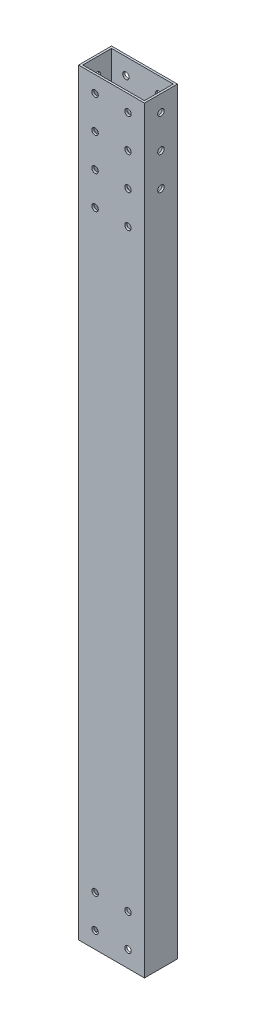
ISO-10303-21;
HEADER;
FILE_DESCRIPTION(('STEP AP214'),'2;1');
FILE_NAME('part.step','',(''),(''),'','','');
FILE_SCHEMA(('AUTOMOTIVE_DESIGN { 1 0 10303 214 1 1 1 1 }'));
ENDSEC;
DATA;
#1=APPLICATION_CONTEXT('core data for automotive mechanical design processes');
#2=APPLICATION_PROTOCOL_DEFINITION('international standard','automotive_design',2000,#1);
#3=PRODUCT_CONTEXT('',#1,'mechanical');
#4=PRODUCT('Part','Part','',(#3));
#5=PRODUCT_RELATED_PRODUCT_CATEGORY('part','',(#4));
#6=PRODUCT_DEFINITION_FORMATION('','',#4);
#7=PRODUCT_DEFINITION_CONTEXT('part definition',#1,'design');
#8=PRODUCT_DEFINITION('design','',#6,#7);
#9=PRODUCT_DEFINITION_SHAPE('','',#8);
#10=(LENGTH_UNIT() NAMED_UNIT(*) SI_UNIT(.MILLI.,.METRE.));
#11=(NAMED_UNIT(*) PLANE_ANGLE_UNIT() SI_UNIT($,.RADIAN.));
#12=(NAMED_UNIT(*) SI_UNIT($,.STERADIAN.) SOLID_ANGLE_UNIT());
#13=UNCERTAINTY_MEASURE_WITH_UNIT(LENGTH_MEASURE(1.E-05),#10,'distance_accuracy_value','');
#14=(GEOMETRIC_REPRESENTATION_CONTEXT(3) GLOBAL_UNCERTAINTY_ASSIGNED_CONTEXT((#13)) GLOBAL_UNIT_ASSIGNED_CONTEXT((#10,
#11,#12)) REPRESENTATION_CONTEXT('',''));
#15=CARTESIAN_POINT('',(0.,0.,0.));
#16=DIRECTION('',(0.,0.,1.));
#17=DIRECTION('',(1.,0.,0.));
#18=AXIS2_PLACEMENT_3D('',#15,#16,#17);
#19=CARTESIAN_POINT('',(533.4,627.126,12.7));
#20=DIRECTION('',(0.,-1.,0.));
#21=DIRECTION('',(0.,0.,-1.));
#22=AXIS2_PLACEMENT_3D('',#19,#20,#21);
#23=PLANE('',#22);
#24=DIRECTION('',(-1.,0.,0.));
#25=VECTOR('',#24,1.);
#26=CARTESIAN_POINT('',(533.4,627.126,-12.7));
#27=LINE('',#26,#25);
#28=CARTESIAN_POINT('',(533.4,627.126,-12.7));
#29=VERTEX_POINT('',#28);
#30=CARTESIAN_POINT('',(482.6,627.126,-12.7));
#31=VERTEX_POINT('',#30);
#32=EDGE_CURVE('E134',#29,#31,#27,.T.);
#33=ORIENTED_EDGE('',*,*,#32,.T.);
#34=DIRECTION('',(0.,0.,-1.));
#35=VECTOR('',#34,1.);
#36=CARTESIAN_POINT('',(482.6,627.126,12.7));
#37=LINE('',#36,#35);
#38=CARTESIAN_POINT('',(482.6,627.126,12.7));
#39=VERTEX_POINT('',#38);
#40=EDGE_CURVE('E11',#39,#31,#37,.T.);
#41=ORIENTED_EDGE('',*,*,#40,.F.);
#42=DIRECTION('',(-1.,0.,0.));
#43=VECTOR('',#42,1.);
#44=CARTESIAN_POINT('',(533.4,627.126,12.7));
#45=LINE('',#44,#43);
#46=CARTESIAN_POINT('',(533.4,627.126,12.7));
#47=VERTEX_POINT('',#46);
#48=EDGE_CURVE('E140',#47,#39,#45,.T.);
#49=ORIENTED_EDGE('',*,*,#48,.F.);
#50=DIRECTION('',(0.,0.,-1.));
#51=VECTOR('',#50,1.);
#52=CARTESIAN_POINT('',(533.4,627.126,12.7));
#53=LINE('',#52,#51);
#54=EDGE_CURVE('E152',#47,#29,#53,.T.);
#55=ORIENTED_EDGE('',*,*,#54,.T.);
#56=EDGE_LOOP('',(#33,#41,#49,#55));
#57=FACE_BOUND('',#56,.T.);
#58=DIRECTION('',(-1.,0.,0.));
#59=VECTOR('',#58,1.);
#60=CARTESIAN_POINT('',(533.4,627.126,-11.1125));
#61=LINE('',#60,#59);
#62=CARTESIAN_POINT('',(531.8125,627.126,-11.1125));
#63=VERTEX_POINT('',#62);
#64=CARTESIAN_POINT('',(484.1875,627.126,-11.1125));
#65=VERTEX_POINT('',#64);
#66=EDGE_CURVE('E120',#63,#65,#61,.T.);
#67=ORIENTED_EDGE('',*,*,#66,.F.);
#68=DIRECTION('',(0.,0.,-1.));
#69=VECTOR('',#68,1.);
#70=CARTESIAN_POINT('',(531.8125,627.126,12.7));
#71=LINE('',#70,#69);
#72=CARTESIAN_POINT('',(531.8125,627.126,11.1125));
#73=VERTEX_POINT('',#72);
#74=EDGE_CURVE('E131',#73,#63,#71,.T.);
#75=ORIENTED_EDGE('',*,*,#74,.F.);
#76=DIRECTION('',(-1.,0.,0.));
#77=VECTOR('',#76,1.);
#78=CARTESIAN_POINT('',(533.4,627.126,11.1125));
#79=LINE('',#78,#77);
#80=CARTESIAN_POINT('',(484.1875,627.126,11.1125));
#81=VERTEX_POINT('',#80);
#82=EDGE_CURVE('E127',#73,#81,#79,.T.);
#83=ORIENTED_EDGE('',*,*,#82,.T.);
#84=DIRECTION('',(0.,0.,-1.));
#85=VECTOR('',#84,1.);
#86=CARTESIAN_POINT('',(484.1875,627.126,12.7));
#87=LINE('',#86,#85);
#88=EDGE_CURVE('E111',#81,#65,#87,.T.);
#89=ORIENTED_EDGE('',*,*,#88,.T.);
#90=EDGE_LOOP('',(#67,#75,#83,#89));
#91=FACE_BOUND('',#90,.T.);
#92=ADVANCED_FACE('F37',(#57,#91),#23,.F.);
#93=CARTESIAN_POINT('',(533.4,42.926,12.7));
#94=DIRECTION('',(0.,-1.,0.));
#95=DIRECTION('',(1.,0.,0.));
#96=AXIS2_PLACEMENT_3D('',#93,#94,#95);
#97=PLANE('',#96);
#98=DIRECTION('',(-1.,0.,0.));
#99=VECTOR('',#98,1.);
#100=CARTESIAN_POINT('',(533.4,42.926,-12.7));
#101=LINE('',#100,#99);
#102=CARTESIAN_POINT('',(533.4,42.926,-12.7));
#103=VERTEX_POINT('',#102);
#104=CARTESIAN_POINT('',(482.6,42.926,-12.7));
#105=VERTEX_POINT('',#104);
#106=EDGE_CURVE('E158',#103,#105,#101,.T.);
#107=ORIENTED_EDGE('',*,*,#106,.F.);
#108=DIRECTION('',(0.,0.,-1.));
#109=VECTOR('',#108,1.);
#110=CARTESIAN_POINT('',(533.4,42.926,12.7));
#111=LINE('',#110,#109);
#112=CARTESIAN_POINT('',(533.4,42.926,12.7));
#113=VERTEX_POINT('',#112);
#114=EDGE_CURVE('E164',#113,#103,#111,.T.);
#115=ORIENTED_EDGE('',*,*,#114,.F.);
#116=DIRECTION('',(-1.,0.,0.));
#117=VECTOR('',#116,1.);
#118=CARTESIAN_POINT('',(533.4,42.926,12.7));
#119=LINE('',#118,#117);
#120=CARTESIAN_POINT('',(482.6,42.926,12.7));
#121=VERTEX_POINT('',#120);
#122=EDGE_CURVE('E146',#113,#121,#119,.T.);
#123=ORIENTED_EDGE('',*,*,#122,.T.);
#124=DIRECTION('',(0.,0.,-1.));
#125=VECTOR('',#124,1.);
#126=CARTESIAN_POINT('',(482.6,42.926,12.7));
#127=LINE('',#126,#125);
#128=EDGE_CURVE('E45',#121,#105,#127,.T.);
#129=ORIENTED_EDGE('',*,*,#128,.T.);
#130=EDGE_LOOP('',(#107,#115,#123,#129));
#131=FACE_BOUND('',#130,.T.);
#132=DIRECTION('',(0.,0.,-1.));
#133=VECTOR('',#132,1.);
#134=CARTESIAN_POINT('',(531.8125,42.926,12.7));
#135=LINE('',#134,#133);
#136=CARTESIAN_POINT('',(531.8125,42.926,11.1125));
#137=VERTEX_POINT('',#136);
#138=CARTESIAN_POINT('',(531.8125,42.926,-11.1125));
#139=VERTEX_POINT('',#138);
#140=EDGE_CURVE('E112',#137,#139,#135,.T.);
#141=ORIENTED_EDGE('',*,*,#140,.T.);
#142=DIRECTION('',(-1.,0.,0.));
#143=VECTOR('',#142,1.);
#144=CARTESIAN_POINT('',(533.4,42.926,-11.1125));
#145=LINE('',#144,#143);
#146=CARTESIAN_POINT('',(484.1875,42.926,-11.1125));
#147=VERTEX_POINT('',#146);
#148=EDGE_CURVE('E117',#139,#147,#145,.T.);
#149=ORIENTED_EDGE('',*,*,#148,.T.);
#150=DIRECTION('',(0.,0.,-1.));
#151=VECTOR('',#150,1.);
#152=CARTESIAN_POINT('',(484.1875,42.926,12.7));
#153=LINE('',#152,#151);
#154=CARTESIAN_POINT('',(484.1875,42.926,11.1125));
#155=VERTEX_POINT('',#154);
#156=EDGE_CURVE('E102',#155,#147,#153,.T.);
#157=ORIENTED_EDGE('',*,*,#156,.F.);
#158=DIRECTION('',(-1.,0.,0.));
#159=VECTOR('',#158,1.);
#160=CARTESIAN_POINT('',(533.4,42.926,11.1125));
#161=LINE('',#160,#159);
#162=EDGE_CURVE('E60',#137,#155,#161,.T.);
#163=ORIENTED_EDGE('',*,*,#162,.F.);
#164=EDGE_LOOP('',(#141,#149,#157,#163));
#165=FACE_BOUND('',#164,.T.);
#166=ADVANCED_FACE('F124',(#131,#165),#97,.T.);
#167=CARTESIAN_POINT('',(482.6,627.126,12.7));
#168=DIRECTION('',(1.,0.,0.));
#169=DIRECTION('',(0.,0.,-1.));
#170=AXIS2_PLACEMENT_3D('',#167,#168,#169);
#171=PLANE('',#170);
#172=CARTESIAN_POINT('',(482.6,614.426,0.));
#173=DIRECTION('',(-1.,0.,0.));
#174=DIRECTION('',(0.,0.,1.));
#175=AXIS2_PLACEMENT_3D('',#172,#173,#174);
#176=CIRCLE('',#175,2.48919999999994);
#177=CARTESIAN_POINT('',(482.6,614.426,2.48919999999994));
#178=VERTEX_POINT('',#177);
#179=EDGE_CURVE('E366',#178,#178,#176,.T.);
#180=ORIENTED_EDGE('',*,*,#179,.F.);
#181=EDGE_LOOP('',(#180));
#182=FACE_BOUND('',#181,.T.);
#183=CARTESIAN_POINT('',(482.6,589.026,0.));
#184=DIRECTION('',(-1.,0.,0.));
#185=DIRECTION('',(0.,0.,1.));
#186=AXIS2_PLACEMENT_3D('',#183,#184,#185);
#187=CIRCLE('',#186,2.48919999999997);
#188=CARTESIAN_POINT('',(482.6,589.026,2.48919999999997));
#189=VERTEX_POINT('',#188);
#190=EDGE_CURVE('E370',#189,#189,#187,.T.);
#191=ORIENTED_EDGE('',*,*,#190,.F.);
#192=EDGE_LOOP('',(#191));
#193=FACE_BOUND('',#192,.T.);
#194=CARTESIAN_POINT('',(482.6,563.626,0.));
#195=DIRECTION('',(-1.,0.,0.));
#196=DIRECTION('',(0.,0.,1.));
#197=AXIS2_PLACEMENT_3D('',#194,#195,#196);
#198=CIRCLE('',#197,2.48919999999998);
#199=CARTESIAN_POINT('',(482.6,563.626,2.48919999999998));
#200=VERTEX_POINT('',#199);
#201=EDGE_CURVE('E227',#200,#200,#198,.T.);
#202=ORIENTED_EDGE('',*,*,#201,.F.);
#203=EDGE_LOOP('',(#202));
#204=FACE_BOUND('',#203,.T.);
#205=DIRECTION('',(0.,-1.,0.));
#206=VECTOR('',#205,1.);
#207=CARTESIAN_POINT('',(482.6,627.126,-12.7));
#208=LINE('',#207,#206);
#209=EDGE_CURVE('E155',#31,#105,#208,.T.);
#210=ORIENTED_EDGE('',*,*,#209,.T.);
#211=ORIENTED_EDGE('',*,*,#128,.F.);
#212=DIRECTION('',(0.,-1.,0.));
#213=VECTOR('',#212,1.);
#214=CARTESIAN_POINT('',(482.6,627.126,12.7));
#215=LINE('',#214,#213);
#216=EDGE_CURVE('E143',#39,#121,#215,.T.);
#217=ORIENTED_EDGE('',*,*,#216,.F.);
#218=ORIENTED_EDGE('',*,*,#40,.T.);
#219=EDGE_LOOP('',(#210,#211,#217,#218));
#220=FACE_BOUND('',#219,.T.);
#221=ADVANCED_FACE('F328',(#182,#193,#204,#220),#171,.F.);
#222=CARTESIAN_POINT('',(533.4,627.126,12.7));
#223=DIRECTION('',(1.,0.,0.));
#224=DIRECTION('',(0.,0.,-1.));
#225=AXIS2_PLACEMENT_3D('',#222,#223,#224);
#226=PLANE('',#225);
#227=CARTESIAN_POINT('',(533.4,614.426,0.));
#228=DIRECTION('',(-1.,0.,0.));
#229=DIRECTION('',(0.,0.,1.));
#230=AXIS2_PLACEMENT_3D('',#227,#228,#229);
#231=CIRCLE('',#230,2.48919999999994);
#232=CARTESIAN_POINT('',(533.4,614.426,2.48919999999994));
#233=VERTEX_POINT('',#232);
#234=EDGE_CURVE('E203',#233,#233,#231,.T.);
#235=ORIENTED_EDGE('',*,*,#234,.T.);
#236=EDGE_LOOP('',(#235));
#237=FACE_BOUND('',#236,.T.);
#238=CARTESIAN_POINT('',(533.4,589.026,0.));
#239=DIRECTION('',(-1.,0.,0.));
#240=DIRECTION('',(0.,0.,1.));
#241=AXIS2_PLACEMENT_3D('',#238,#239,#240);
#242=CIRCLE('',#241,2.48919999999997);
#243=CARTESIAN_POINT('',(533.4,589.026,2.48919999999997));
#244=VERTEX_POINT('',#243);
#245=EDGE_CURVE('E232',#244,#244,#242,.T.);
#246=ORIENTED_EDGE('',*,*,#245,.T.);
#247=EDGE_LOOP('',(#246));
#248=FACE_BOUND('',#247,.T.);
#249=CARTESIAN_POINT('',(533.4,563.626,0.));
#250=DIRECTION('',(-1.,0.,0.));
#251=DIRECTION('',(0.,0.,1.));
#252=AXIS2_PLACEMENT_3D('',#249,#250,#251);
#253=CIRCLE('',#252,2.48919999999998);
#254=CARTESIAN_POINT('',(533.4,563.626,2.48919999999998));
#255=VERTEX_POINT('',#254);
#256=EDGE_CURVE('E223',#255,#255,#253,.T.);
#257=ORIENTED_EDGE('',*,*,#256,.T.);
#258=EDGE_LOOP('',(#257));
#259=FACE_BOUND('',#258,.T.);
#260=DIRECTION('',(0.,-1.,0.));
#261=VECTOR('',#260,1.);
#262=CARTESIAN_POINT('',(533.4,627.126,-12.7));
#263=LINE('',#262,#261);
#264=EDGE_CURVE('E144',#29,#103,#263,.T.);
#265=ORIENTED_EDGE('',*,*,#264,.F.);
#266=ORIENTED_EDGE('',*,*,#54,.F.);
#267=DIRECTION('',(0.,-1.,0.));
#268=VECTOR('',#267,1.);
#269=CARTESIAN_POINT('',(533.4,627.126,12.7));
#270=LINE('',#269,#268);
#271=EDGE_CURVE('E149',#47,#113,#270,.T.);
#272=ORIENTED_EDGE('',*,*,#271,.T.);
#273=ORIENTED_EDGE('',*,*,#114,.T.);
#274=EDGE_LOOP('',(#265,#266,#272,#273));
#275=FACE_BOUND('',#274,.T.);
#276=ADVANCED_FACE('F337',(#237,#248,#259,#275),#226,.T.);
#277=CARTESIAN_POINT('',(0.,0.,12.7));
#278=DIRECTION('',(0.,0.,1.));
#279=DIRECTION('',(1.,0.,0.));
#280=AXIS2_PLACEMENT_3D('',#277,#278,#279);
#281=PLANE('',#280);
#282=CARTESIAN_POINT('',(495.300000000002,55.626,12.7));
#283=DIRECTION('',(0.,0.,1.));
#284=DIRECTION('',(1.,0.,0.));
#285=AXIS2_PLACEMENT_3D('',#282,#283,#284);
#286=CIRCLE('',#285,2.48920000000001);
#287=CARTESIAN_POINT('',(497.789200000002,55.626,12.7));
#288=VERTEX_POINT('',#287);
#289=EDGE_CURVE('E794',#288,#288,#286,.T.);
#290=ORIENTED_EDGE('',*,*,#289,.F.);
#291=EDGE_LOOP('',(#290));
#292=FACE_BOUND('',#291,.T.);
#293=CARTESIAN_POINT('',(520.700000000002,55.6260000000004,12.7));
#294=DIRECTION('',(0.,0.,1.));
#295=DIRECTION('',(1.,0.,0.));
#296=AXIS2_PLACEMENT_3D('',#293,#294,#295);
#297=CIRCLE('',#296,2.48920000000006);
#298=CARTESIAN_POINT('',(523.189200000002,55.6260000000004,12.7));
#299=VERTEX_POINT('',#298);
#300=EDGE_CURVE('E795',#299,#299,#297,.T.);
#301=ORIENTED_EDGE('',*,*,#300,.F.);
#302=EDGE_LOOP('',(#301));
#303=FACE_BOUND('',#302,.T.);
#304=CARTESIAN_POINT('',(520.700000000002,81.0260000000004,12.7));
#305=DIRECTION('',(0.,0.,1.));
#306=DIRECTION('',(1.,0.,0.));
#307=AXIS2_PLACEMENT_3D('',#304,#305,#306);
#308=CIRCLE('',#307,2.48919999999995);
#309=CARTESIAN_POINT('',(523.189200000002,81.0260000000004,12.7));
#310=VERTEX_POINT('',#309);
#311=EDGE_CURVE('E798',#310,#310,#308,.T.);
#312=ORIENTED_EDGE('',*,*,#311,.F.);
#313=EDGE_LOOP('',(#312));
#314=FACE_BOUND('',#313,.T.);
#315=CARTESIAN_POINT('',(495.300000000002,81.026,12.7));
#316=DIRECTION('',(0.,0.,1.));
#317=DIRECTION('',(1.,0.,0.));
#318=AXIS2_PLACEMENT_3D('',#315,#316,#317);
#319=CIRCLE('',#318,2.48920000000001);
#320=CARTESIAN_POINT('',(497.789200000002,81.026,12.7));
#321=VERTEX_POINT('',#320);
#322=EDGE_CURVE('E216',#321,#321,#319,.T.);
#323=ORIENTED_EDGE('',*,*,#322,.F.);
#324=EDGE_LOOP('',(#323));
#325=FACE_BOUND('',#324,.T.);
#326=CARTESIAN_POINT('',(520.700000000001,563.626,12.7));
#327=DIRECTION('',(0.,0.,1.));
#328=DIRECTION('',(1.,0.,0.));
#329=AXIS2_PLACEMENT_3D('',#326,#327,#328);
#330=CIRCLE('',#329,2.48919999999994);
#331=CARTESIAN_POINT('',(523.189200000001,563.626,12.7));
#332=VERTEX_POINT('',#331);
#333=EDGE_CURVE('E265',#332,#332,#330,.T.);
#334=ORIENTED_EDGE('',*,*,#333,.F.);
#335=EDGE_LOOP('',(#334));
#336=FACE_BOUND('',#335,.T.);
#337=CARTESIAN_POINT('',(495.3,589.026,12.7));
#338=DIRECTION('',(0.,0.,1.));
#339=DIRECTION('',(1.,0.,0.));
#340=AXIS2_PLACEMENT_3D('',#337,#338,#339);
#341=CIRCLE('',#340,2.48919999999999);
#342=CARTESIAN_POINT('',(497.7892,589.026,12.7));
#343=VERTEX_POINT('',#342);
#344=EDGE_CURVE('E264',#343,#343,#341,.T.);
#345=ORIENTED_EDGE('',*,*,#344,.F.);
#346=EDGE_LOOP('',(#345));
#347=FACE_BOUND('',#346,.T.);
#348=CARTESIAN_POINT('',(520.7,589.026,12.7));
#349=DIRECTION('',(0.,0.,1.));
#350=DIRECTION('',(1.,0.,0.));
#351=AXIS2_PLACEMENT_3D('',#348,#349,#350);
#352=CIRCLE('',#351,2.48919999999994);
#353=CARTESIAN_POINT('',(523.1892,589.026,12.7));
#354=VERTEX_POINT('',#353);
#355=EDGE_CURVE('E277',#354,#354,#352,.T.);
#356=ORIENTED_EDGE('',*,*,#355,.F.);
#357=EDGE_LOOP('',(#356));
#358=FACE_BOUND('',#357,.T.);
#359=CARTESIAN_POINT('',(495.3,614.426,12.7));
#360=DIRECTION('',(0.,0.,1.));
#361=DIRECTION('',(1.,0.,0.));
#362=AXIS2_PLACEMENT_3D('',#359,#360,#361);
#363=CIRCLE('',#362,2.48919999999999);
#364=CARTESIAN_POINT('',(497.7892,614.426,12.7));
#365=VERTEX_POINT('',#364);
#366=EDGE_CURVE('E276',#365,#365,#363,.T.);
#367=ORIENTED_EDGE('',*,*,#366,.F.);
#368=EDGE_LOOP('',(#367));
#369=FACE_BOUND('',#368,.T.);
#370=CARTESIAN_POINT('',(495.300000000001,538.226,12.7));
#371=DIRECTION('',(0.,0.,1.));
#372=DIRECTION('',(1.,0.,0.));
#373=AXIS2_PLACEMENT_3D('',#370,#371,#372);
#374=CIRCLE('',#373,2.48920000000002);
#375=CARTESIAN_POINT('',(497.789200000001,538.226,12.7));
#376=VERTEX_POINT('',#375);
#377=EDGE_CURVE('E245',#376,#376,#374,.T.);
#378=ORIENTED_EDGE('',*,*,#377,.F.);
#379=EDGE_LOOP('',(#378));
#380=FACE_BOUND('',#379,.T.);
#381=CARTESIAN_POINT('',(495.300000000001,563.626,12.7));
#382=DIRECTION('',(0.,0.,1.));
#383=DIRECTION('',(1.,0.,0.));
#384=AXIS2_PLACEMENT_3D('',#381,#382,#383);
#385=CIRCLE('',#384,2.48919999999999);
#386=CARTESIAN_POINT('',(497.789200000001,563.626,12.7));
#387=VERTEX_POINT('',#386);
#388=EDGE_CURVE('E253',#387,#387,#385,.T.);
#389=ORIENTED_EDGE('',*,*,#388,.F.);
#390=EDGE_LOOP('',(#389));
#391=FACE_BOUND('',#390,.T.);
#392=CARTESIAN_POINT('',(520.700000000001,538.226,12.7));
#393=DIRECTION('',(0.,0.,1.));
#394=DIRECTION('',(1.,0.,0.));
#395=AXIS2_PLACEMENT_3D('',#392,#393,#394);
#396=CIRCLE('',#395,2.48920000000008);
#397=CARTESIAN_POINT('',(523.189200000001,538.226,12.7));
#398=VERTEX_POINT('',#397);
#399=EDGE_CURVE('E252',#398,#398,#396,.T.);
#400=ORIENTED_EDGE('',*,*,#399,.F.);
#401=EDGE_LOOP('',(#400));
#402=FACE_BOUND('',#401,.T.);
#403=CARTESIAN_POINT('',(520.7,614.426,12.7));
#404=DIRECTION('',(0.,0.,1.));
#405=DIRECTION('',(1.,0.,0.));
#406=AXIS2_PLACEMENT_3D('',#403,#404,#405);
#407=CIRCLE('',#406,2.48920000000004);
#408=CARTESIAN_POINT('',(523.1892,614.426,12.7));
#409=VERTEX_POINT('',#408);
#410=EDGE_CURVE('E280',#409,#409,#407,.T.);
#411=ORIENTED_EDGE('',*,*,#410,.F.);
#412=EDGE_LOOP('',(#411));
#413=FACE_BOUND('',#412,.T.);
#414=ORIENTED_EDGE('',*,*,#48,.T.);
#415=ORIENTED_EDGE('',*,*,#216,.T.);
#416=ORIENTED_EDGE('',*,*,#122,.F.);
#417=ORIENTED_EDGE('',*,*,#271,.F.);
#418=EDGE_LOOP('',(#414,#415,#416,#417));
#419=FACE_BOUND('',#418,.T.);
#420=ADVANCED_FACE('F344',(#292,#303,#314,#325,#336,#347,#358,#369,#380,#391,#402,#413,#419),
#281,.T.);
#421=CARTESIAN_POINT('',(0.,0.,-12.7));
#422=DIRECTION('',(0.,0.,1.));
#423=DIRECTION('',(1.,0.,0.));
#424=AXIS2_PLACEMENT_3D('',#421,#422,#423);
#425=PLANE('',#424);
#426=CARTESIAN_POINT('',(520.700000000001,563.626,-12.7));
#427=DIRECTION('',(0.,0.,1.));
#428=DIRECTION('',(1.,0.,0.));
#429=AXIS2_PLACEMENT_3D('',#426,#427,#428);
#430=CIRCLE('',#429,2.48919999999994);
#431=CARTESIAN_POINT('',(523.189200000001,563.626,-12.7));
#432=VERTEX_POINT('',#431);
#433=EDGE_CURVE('E256',#432,#432,#430,.T.);
#434=ORIENTED_EDGE('',*,*,#433,.T.);
#435=EDGE_LOOP('',(#434));
#436=FACE_BOUND('',#435,.T.);
#437=CARTESIAN_POINT('',(495.3,589.026,-12.7));
#438=DIRECTION('',(0.,0.,1.));
#439=DIRECTION('',(1.,0.,0.));
#440=AXIS2_PLACEMENT_3D('',#437,#438,#439);
#441=CIRCLE('',#440,2.48919999999999);
#442=CARTESIAN_POINT('',(497.7892,589.026,-12.7));
#443=VERTEX_POINT('',#442);
#444=EDGE_CURVE('E261',#443,#443,#441,.T.);
#445=ORIENTED_EDGE('',*,*,#444,.T.);
#446=EDGE_LOOP('',(#445));
#447=FACE_BOUND('',#446,.T.);
#448=CARTESIAN_POINT('',(520.7,589.026,-12.7));
#449=DIRECTION('',(0.,0.,1.));
#450=DIRECTION('',(1.,0.,0.));
#451=AXIS2_PLACEMENT_3D('',#448,#449,#450);
#452=CIRCLE('',#451,2.48919999999994);
#453=CARTESIAN_POINT('',(523.1892,589.026,-12.7));
#454=VERTEX_POINT('',#453);
#455=EDGE_CURVE('E268',#454,#454,#452,.T.);
#456=ORIENTED_EDGE('',*,*,#455,.T.);
#457=EDGE_LOOP('',(#456));
#458=FACE_BOUND('',#457,.T.);
#459=CARTESIAN_POINT('',(495.3,614.426,-12.7));
#460=DIRECTION('',(0.,0.,1.));
#461=DIRECTION('',(1.,0.,0.));
#462=AXIS2_PLACEMENT_3D('',#459,#460,#461);
#463=CIRCLE('',#462,2.48919999999999);
#464=CARTESIAN_POINT('',(497.7892,614.426,-12.7));
#465=VERTEX_POINT('',#464);
#466=EDGE_CURVE('E273',#465,#465,#463,.T.);
#467=ORIENTED_EDGE('',*,*,#466,.T.);
#468=EDGE_LOOP('',(#467));
#469=FACE_BOUND('',#468,.T.);
#470=CARTESIAN_POINT('',(495.300000000001,538.226,-12.7));
#471=DIRECTION('',(0.,0.,1.));
#472=DIRECTION('',(1.,0.,0.));
#473=AXIS2_PLACEMENT_3D('',#470,#471,#472);
#474=CIRCLE('',#473,2.48920000000002);
#475=CARTESIAN_POINT('',(497.789200000001,538.226,-12.7));
#476=VERTEX_POINT('',#475);
#477=EDGE_CURVE('E242',#476,#476,#474,.T.);
#478=ORIENTED_EDGE('',*,*,#477,.T.);
#479=EDGE_LOOP('',(#478));
#480=FACE_BOUND('',#479,.T.);
#481=CARTESIAN_POINT('',(495.300000000001,563.626,-12.7));
#482=DIRECTION('',(0.,0.,1.));
#483=DIRECTION('',(1.,0.,0.));
#484=AXIS2_PLACEMENT_3D('',#481,#482,#483);
#485=CIRCLE('',#484,2.48919999999999);
#486=CARTESIAN_POINT('',(497.789200000001,563.626,-12.7));
#487=VERTEX_POINT('',#486);
#488=EDGE_CURVE('E248',#487,#487,#485,.T.);
#489=ORIENTED_EDGE('',*,*,#488,.T.);
#490=EDGE_LOOP('',(#489));
#491=FACE_BOUND('',#490,.T.);
#492=CARTESIAN_POINT('',(520.700000000001,538.226,-12.7));
#493=DIRECTION('',(0.,0.,1.));
#494=DIRECTION('',(1.,0.,0.));
#495=AXIS2_PLACEMENT_3D('',#492,#493,#494);
#496=CIRCLE('',#495,2.48920000000008);
#497=CARTESIAN_POINT('',(523.189200000001,538.226,-12.7));
#498=VERTEX_POINT('',#497);
#499=EDGE_CURVE('E249',#498,#498,#496,.T.);
#500=ORIENTED_EDGE('',*,*,#499,.T.);
#501=EDGE_LOOP('',(#500));
#502=FACE_BOUND('',#501,.T.);
#503=CARTESIAN_POINT('',(520.7,614.426,-12.7));
#504=DIRECTION('',(0.,0.,1.));
#505=DIRECTION('',(1.,0.,0.));
#506=AXIS2_PLACEMENT_3D('',#503,#504,#505);
#507=CIRCLE('',#506,2.48920000000004);
#508=CARTESIAN_POINT('',(523.1892,614.426,-12.7));
#509=VERTEX_POINT('',#508);
#510=EDGE_CURVE('E171',#509,#509,#507,.T.);
#511=ORIENTED_EDGE('',*,*,#510,.T.);
#512=EDGE_LOOP('',(#511));
#513=FACE_BOUND('',#512,.T.);
#514=ORIENTED_EDGE('',*,*,#32,.F.);
#515=ORIENTED_EDGE('',*,*,#264,.T.);
#516=ORIENTED_EDGE('',*,*,#106,.T.);
#517=ORIENTED_EDGE('',*,*,#209,.F.);
#518=EDGE_LOOP('',(#514,#515,#516,#517));
#519=FACE_BOUND('',#518,.T.);
#520=ADVANCED_FACE('F319',(#436,#447,#458,#469,#480,#491,#502,#513,#519),#425,.F.);
#521=CARTESIAN_POINT('',(484.1875,627.126,12.7));
#522=DIRECTION('',(1.,0.,0.));
#523=DIRECTION('',(0.,0.,-1.));
#524=AXIS2_PLACEMENT_3D('',#521,#522,#523);
#525=PLANE('',#524);
#526=CARTESIAN_POINT('',(484.1875,614.426,0.));
#527=DIRECTION('',(1.,0.,0.));
#528=DIRECTION('',(0.,0.,-1.));
#529=AXIS2_PLACEMENT_3D('',#526,#527,#528);
#530=CIRCLE('',#529,2.48919999999994);
#531=CARTESIAN_POINT('',(484.1875,614.426,-2.48919999999994));
#532=VERTEX_POINT('',#531);
#533=EDGE_CURVE('E211',#532,#532,#530,.T.);
#534=ORIENTED_EDGE('',*,*,#533,.F.);
#535=EDGE_LOOP('',(#534));
#536=FACE_BOUND('',#535,.T.);
#537=CARTESIAN_POINT('',(484.1875,589.026,0.));
#538=DIRECTION('',(1.,0.,0.));
#539=DIRECTION('',(0.,0.,-1.));
#540=AXIS2_PLACEMENT_3D('',#537,#538,#539);
#541=CIRCLE('',#540,2.48919999999997);
#542=CARTESIAN_POINT('',(484.1875,589.026,-2.48919999999997));
#543=VERTEX_POINT('',#542);
#544=EDGE_CURVE('E207',#543,#543,#541,.T.);
#545=ORIENTED_EDGE('',*,*,#544,.F.);
#546=EDGE_LOOP('',(#545));
#547=FACE_BOUND('',#546,.T.);
#548=CARTESIAN_POINT('',(484.1875,563.626,0.));
#549=DIRECTION('',(1.,0.,0.));
#550=DIRECTION('',(0.,0.,-1.));
#551=AXIS2_PLACEMENT_3D('',#548,#549,#550);
#552=CIRCLE('',#551,2.48919999999998);
#553=CARTESIAN_POINT('',(484.1875,563.626,-2.48919999999998));
#554=VERTEX_POINT('',#553);
#555=EDGE_CURVE('E202',#554,#554,#552,.T.);
#556=ORIENTED_EDGE('',*,*,#555,.F.);
#557=EDGE_LOOP('',(#556));
#558=FACE_BOUND('',#557,.T.);
#559=DIRECTION('',(0.,-1.,0.));
#560=VECTOR('',#559,1.);
#561=CARTESIAN_POINT('',(484.1875,627.126,-11.1125));
#562=LINE('',#561,#560);
#563=EDGE_CURVE('E106',#65,#147,#562,.T.);
#564=ORIENTED_EDGE('',*,*,#563,.F.);
#565=ORIENTED_EDGE('',*,*,#88,.F.);
#566=DIRECTION('',(0.,-1.,0.));
#567=VECTOR('',#566,1.);
#568=CARTESIAN_POINT('',(484.1875,627.126,11.1125));
#569=LINE('',#568,#567);
#570=EDGE_CURVE('E108',#81,#155,#569,.T.);
#571=ORIENTED_EDGE('',*,*,#570,.T.);
#572=ORIENTED_EDGE('',*,*,#156,.T.);
#573=EDGE_LOOP('',(#564,#565,#571,#572));
#574=FACE_BOUND('',#573,.T.);
#575=ADVANCED_FACE('F104',(#536,#547,#558,#574),#525,.T.);
#576=CARTESIAN_POINT('',(531.8125,627.126,12.7));
#577=DIRECTION('',(1.,0.,0.));
#578=DIRECTION('',(0.,0.,-1.));
#579=AXIS2_PLACEMENT_3D('',#576,#577,#578);
#580=PLANE('',#579);
#581=CARTESIAN_POINT('',(531.8125,614.426,0.));
#582=DIRECTION('',(1.,0.,0.));
#583=DIRECTION('',(0.,0.,-1.));
#584=AXIS2_PLACEMENT_3D('',#581,#582,#583);
#585=CIRCLE('',#584,2.48919999999994);
#586=CARTESIAN_POINT('',(531.8125,614.426,-2.48919999999994));
#587=VERTEX_POINT('',#586);
#588=EDGE_CURVE('E208',#587,#587,#585,.T.);
#589=ORIENTED_EDGE('',*,*,#588,.T.);
#590=EDGE_LOOP('',(#589));
#591=FACE_BOUND('',#590,.T.);
#592=CARTESIAN_POINT('',(531.8125,589.026,0.));
#593=DIRECTION('',(1.,0.,0.));
#594=DIRECTION('',(0.,0.,-1.));
#595=AXIS2_PLACEMENT_3D('',#592,#593,#594);
#596=CIRCLE('',#595,2.48919999999997);
#597=CARTESIAN_POINT('',(531.8125,589.026,-2.48919999999997));
#598=VERTEX_POINT('',#597);
#599=EDGE_CURVE('E204',#598,#598,#596,.T.);
#600=ORIENTED_EDGE('',*,*,#599,.T.);
#601=EDGE_LOOP('',(#600));
#602=FACE_BOUND('',#601,.T.);
#603=CARTESIAN_POINT('',(531.8125,563.626,0.));
#604=DIRECTION('',(1.,0.,0.));
#605=DIRECTION('',(0.,0.,-1.));
#606=AXIS2_PLACEMENT_3D('',#603,#604,#605);
#607=CIRCLE('',#606,2.48919999999998);
#608=CARTESIAN_POINT('',(531.8125,563.626,-2.48919999999998));
#609=VERTEX_POINT('',#608);
#610=EDGE_CURVE('E199',#609,#609,#607,.T.);
#611=ORIENTED_EDGE('',*,*,#610,.T.);
#612=EDGE_LOOP('',(#611));
#613=FACE_BOUND('',#612,.T.);
#614=DIRECTION('',(0.,-1.,0.));
#615=VECTOR('',#614,1.);
#616=CARTESIAN_POINT('',(531.8125,627.126,-11.1125));
#617=LINE('',#616,#615);
#618=EDGE_CURVE('E125',#63,#139,#617,.T.);
#619=ORIENTED_EDGE('',*,*,#618,.T.);
#620=ORIENTED_EDGE('',*,*,#140,.F.);
#621=DIRECTION('',(0.,-1.,0.));
#622=VECTOR('',#621,1.);
#623=CARTESIAN_POINT('',(531.8125,627.126,11.1125));
#624=LINE('',#623,#622);
#625=EDGE_CURVE('E53',#73,#137,#624,.T.);
#626=ORIENTED_EDGE('',*,*,#625,.F.);
#627=ORIENTED_EDGE('',*,*,#74,.T.);
#628=EDGE_LOOP('',(#619,#620,#626,#627));
#629=FACE_BOUND('',#628,.T.);
#630=ADVANCED_FACE('F309',(#591,#602,#613,#629),#580,.F.);
#631=CARTESIAN_POINT('',(0.,0.,11.1125));
#632=DIRECTION('',(0.,0.,1.));
#633=DIRECTION('',(1.,0.,0.));
#634=AXIS2_PLACEMENT_3D('',#631,#632,#633);
#635=PLANE('',#634);
#636=CARTESIAN_POINT('',(495.300000000002,55.626,11.1125));
#637=DIRECTION('',(0.,0.,1.));
#638=DIRECTION('',(1.,0.,0.));
#639=AXIS2_PLACEMENT_3D('',#636,#637,#638);
#640=CIRCLE('',#639,2.48920000000001);
#641=CARTESIAN_POINT('',(497.789200000002,55.626,11.1125));
#642=VERTEX_POINT('',#641);
#643=EDGE_CURVE('E40',#642,#642,#640,.F.);
#644=ORIENTED_EDGE('',*,*,#643,.F.);
#645=EDGE_LOOP('',(#644));
#646=FACE_BOUND('',#645,.T.);
#647=CARTESIAN_POINT('',(520.700000000002,55.6260000000004,11.1125));
#648=DIRECTION('',(0.,0.,1.));
#649=DIRECTION('',(1.,0.,0.));
#650=AXIS2_PLACEMENT_3D('',#647,#648,#649);
#651=CIRCLE('',#650,2.48920000000006);
#652=CARTESIAN_POINT('',(523.189200000002,55.6260000000004,11.1125));
#653=VERTEX_POINT('',#652);
#654=EDGE_CURVE('E218',#653,#653,#651,.F.);
#655=ORIENTED_EDGE('',*,*,#654,.F.);
#656=EDGE_LOOP('',(#655));
#657=FACE_BOUND('',#656,.T.);
#658=CARTESIAN_POINT('',(520.700000000002,81.0260000000004,11.1125));
#659=DIRECTION('',(0.,0.,1.));
#660=DIRECTION('',(1.,0.,0.));
#661=AXIS2_PLACEMENT_3D('',#658,#659,#660);
#662=CIRCLE('',#661,2.48919999999995);
#663=CARTESIAN_POINT('',(523.189200000002,81.0260000000004,11.1125));
#664=VERTEX_POINT('',#663);
#665=EDGE_CURVE('E215',#664,#664,#662,.F.);
#666=ORIENTED_EDGE('',*,*,#665,.F.);
#667=EDGE_LOOP('',(#666));
#668=FACE_BOUND('',#667,.T.);
#669=CARTESIAN_POINT('',(495.300000000002,81.026,11.1125));
#670=DIRECTION('',(0.,0.,1.));
#671=DIRECTION('',(1.,0.,0.));
#672=AXIS2_PLACEMENT_3D('',#669,#670,#671);
#673=CIRCLE('',#672,2.48920000000001);
#674=CARTESIAN_POINT('',(497.789200000002,81.026,11.1125));
#675=VERTEX_POINT('',#674);
#676=EDGE_CURVE('E212',#675,#675,#673,.F.);
#677=ORIENTED_EDGE('',*,*,#676,.F.);
#678=EDGE_LOOP('',(#677));
#679=FACE_BOUND('',#678,.T.);
#680=CARTESIAN_POINT('',(520.700000000001,563.626,11.1125));
#681=DIRECTION('',(0.,0.,1.));
#682=DIRECTION('',(1.,0.,0.));
#683=AXIS2_PLACEMENT_3D('',#680,#681,#682);
#684=CIRCLE('',#683,2.48919999999994);
#685=CARTESIAN_POINT('',(523.189200000001,563.626,11.1125));
#686=VERTEX_POINT('',#685);
#687=EDGE_CURVE('E139',#686,#686,#684,.T.);
#688=ORIENTED_EDGE('',*,*,#687,.T.);
#689=EDGE_LOOP('',(#688));
#690=FACE_BOUND('',#689,.T.);
#691=CARTESIAN_POINT('',(495.3,589.026,11.1125));
#692=DIRECTION('',(0.,0.,1.));
#693=DIRECTION('',(1.,0.,0.));
#694=AXIS2_PLACEMENT_3D('',#691,#692,#693);
#695=CIRCLE('',#694,2.48919999999999);
#696=CARTESIAN_POINT('',(497.7892,589.026,11.1125));
#697=VERTEX_POINT('',#696);
#698=EDGE_CURVE('E195',#697,#697,#695,.T.);
#699=ORIENTED_EDGE('',*,*,#698,.T.);
#700=EDGE_LOOP('',(#699));
#701=FACE_BOUND('',#700,.T.);
#702=CARTESIAN_POINT('',(520.7,589.026,11.1125));
#703=DIRECTION('',(0.,0.,1.));
#704=DIRECTION('',(1.,0.,0.));
#705=AXIS2_PLACEMENT_3D('',#702,#703,#704);
#706=CIRCLE('',#705,2.48919999999994);
#707=CARTESIAN_POINT('',(523.1892,589.026,11.1125));
#708=VERTEX_POINT('',#707);
#709=EDGE_CURVE('E191',#708,#708,#706,.T.);
#710=ORIENTED_EDGE('',*,*,#709,.T.);
#711=EDGE_LOOP('',(#710));
#712=FACE_BOUND('',#711,.T.);
#713=CARTESIAN_POINT('',(495.3,614.426,11.1125));
#714=DIRECTION('',(0.,0.,1.));
#715=DIRECTION('',(1.,0.,0.));
#716=AXIS2_PLACEMENT_3D('',#713,#714,#715);
#717=CIRCLE('',#716,2.48919999999999);
#718=CARTESIAN_POINT('',(497.7892,614.426,11.1125));
#719=VERTEX_POINT('',#718);
#720=EDGE_CURVE('E187',#719,#719,#717,.T.);
#721=ORIENTED_EDGE('',*,*,#720,.T.);
#722=EDGE_LOOP('',(#721));
#723=FACE_BOUND('',#722,.T.);
#724=CARTESIAN_POINT('',(495.300000000001,538.226,11.1125));
#725=DIRECTION('',(0.,0.,1.));
#726=DIRECTION('',(1.,0.,0.));
#727=AXIS2_PLACEMENT_3D('',#724,#725,#726);
#728=CIRCLE('',#727,2.48920000000002);
#729=CARTESIAN_POINT('',(497.789200000001,538.226,11.1125));
#730=VERTEX_POINT('',#729);
#731=EDGE_CURVE('E183',#730,#730,#728,.T.);
#732=ORIENTED_EDGE('',*,*,#731,.T.);
#733=EDGE_LOOP('',(#732));
#734=FACE_BOUND('',#733,.T.);
#735=CARTESIAN_POINT('',(495.300000000001,563.626,11.1125));
#736=DIRECTION('',(0.,0.,1.));
#737=DIRECTION('',(1.,0.,0.));
#738=AXIS2_PLACEMENT_3D('',#735,#736,#737);
#739=CIRCLE('',#738,2.48919999999999);
#740=CARTESIAN_POINT('',(497.789200000001,563.626,11.1125));
#741=VERTEX_POINT('',#740);
#742=EDGE_CURVE('E179',#741,#741,#739,.T.);
#743=ORIENTED_EDGE('',*,*,#742,.T.);
#744=EDGE_LOOP('',(#743));
#745=FACE_BOUND('',#744,.T.);
#746=CARTESIAN_POINT('',(520.700000000001,538.226,11.1125));
#747=DIRECTION('',(0.,0.,1.));
#748=DIRECTION('',(1.,0.,0.));
#749=AXIS2_PLACEMENT_3D('',#746,#747,#748);
#750=CIRCLE('',#749,2.48920000000008);
#751=CARTESIAN_POINT('',(523.189200000001,538.226,11.1125));
#752=VERTEX_POINT('',#751);
#753=EDGE_CURVE('E175',#752,#752,#750,.T.);
#754=ORIENTED_EDGE('',*,*,#753,.T.);
#755=EDGE_LOOP('',(#754));
#756=FACE_BOUND('',#755,.T.);
#757=CARTESIAN_POINT('',(520.7,614.426,11.1125));
#758=DIRECTION('',(0.,0.,1.));
#759=DIRECTION('',(1.,0.,0.));
#760=AXIS2_PLACEMENT_3D('',#757,#758,#759);
#761=CIRCLE('',#760,2.48920000000004);
#762=CARTESIAN_POINT('',(523.1892,614.426,11.1125));
#763=VERTEX_POINT('',#762);
#764=EDGE_CURVE('E170',#763,#763,#761,.T.);
#765=ORIENTED_EDGE('',*,*,#764,.T.);
#766=EDGE_LOOP('',(#765));
#767=FACE_BOUND('',#766,.T.);
#768=ORIENTED_EDGE('',*,*,#82,.F.);
#769=ORIENTED_EDGE('',*,*,#625,.T.);
#770=ORIENTED_EDGE('',*,*,#162,.T.);
#771=ORIENTED_EDGE('',*,*,#570,.F.);
#772=EDGE_LOOP('',(#768,#769,#770,#771));
#773=FACE_BOUND('',#772,.T.);
#774=ADVANCED_FACE('F306',(#646,#657,#668,#679,#690,#701,#712,#723,#734,#745,#756,#767,#773),
#635,.F.);
#775=CARTESIAN_POINT('',(0.,0.,-11.1125));
#776=DIRECTION('',(0.,0.,1.));
#777=DIRECTION('',(1.,0.,0.));
#778=AXIS2_PLACEMENT_3D('',#775,#776,#777);
#779=PLANE('',#778);
#780=CARTESIAN_POINT('',(520.700000000001,563.626,-11.1125));
#781=DIRECTION('',(0.,0.,1.));
#782=DIRECTION('',(1.,0.,0.));
#783=AXIS2_PLACEMENT_3D('',#780,#781,#782);
#784=CIRCLE('',#783,2.48919999999994);
#785=CARTESIAN_POINT('',(523.189200000001,563.626,-11.1125));
#786=VERTEX_POINT('',#785);
#787=EDGE_CURVE('E196',#786,#786,#784,.T.);
#788=ORIENTED_EDGE('',*,*,#787,.F.);
#789=EDGE_LOOP('',(#788));
#790=FACE_BOUND('',#789,.T.);
#791=CARTESIAN_POINT('',(495.3,589.026,-11.1125));
#792=DIRECTION('',(0.,0.,1.));
#793=DIRECTION('',(1.,0.,0.));
#794=AXIS2_PLACEMENT_3D('',#791,#792,#793);
#795=CIRCLE('',#794,2.48919999999999);
#796=CARTESIAN_POINT('',(497.7892,589.026,-11.1125));
#797=VERTEX_POINT('',#796);
#798=EDGE_CURVE('E192',#797,#797,#795,.T.);
#799=ORIENTED_EDGE('',*,*,#798,.F.);
#800=EDGE_LOOP('',(#799));
#801=FACE_BOUND('',#800,.T.);
#802=CARTESIAN_POINT('',(520.7,589.026,-11.1125));
#803=DIRECTION('',(0.,0.,1.));
#804=DIRECTION('',(1.,0.,0.));
#805=AXIS2_PLACEMENT_3D('',#802,#803,#804);
#806=CIRCLE('',#805,2.48919999999994);
#807=CARTESIAN_POINT('',(523.1892,589.026,-11.1125));
#808=VERTEX_POINT('',#807);
#809=EDGE_CURVE('E188',#808,#808,#806,.T.);
#810=ORIENTED_EDGE('',*,*,#809,.F.);
#811=EDGE_LOOP('',(#810));
#812=FACE_BOUND('',#811,.T.);
#813=CARTESIAN_POINT('',(495.3,614.426,-11.1125));
#814=DIRECTION('',(0.,0.,1.));
#815=DIRECTION('',(1.,0.,0.));
#816=AXIS2_PLACEMENT_3D('',#813,#814,#815);
#817=CIRCLE('',#816,2.48919999999999);
#818=CARTESIAN_POINT('',(497.7892,614.426,-11.1125));
#819=VERTEX_POINT('',#818);
#820=EDGE_CURVE('E184',#819,#819,#817,.T.);
#821=ORIENTED_EDGE('',*,*,#820,.F.);
#822=EDGE_LOOP('',(#821));
#823=FACE_BOUND('',#822,.T.);
#824=CARTESIAN_POINT('',(495.300000000001,538.226,-11.1125));
#825=DIRECTION('',(0.,0.,1.));
#826=DIRECTION('',(1.,0.,0.));
#827=AXIS2_PLACEMENT_3D('',#824,#825,#826);
#828=CIRCLE('',#827,2.48920000000002);
#829=CARTESIAN_POINT('',(497.789200000001,538.226,-11.1125));
#830=VERTEX_POINT('',#829);
#831=EDGE_CURVE('E180',#830,#830,#828,.T.);
#832=ORIENTED_EDGE('',*,*,#831,.F.);
#833=EDGE_LOOP('',(#832));
#834=FACE_BOUND('',#833,.T.);
#835=CARTESIAN_POINT('',(495.300000000001,563.626,-11.1125));
#836=DIRECTION('',(0.,0.,1.));
#837=DIRECTION('',(1.,0.,0.));
#838=AXIS2_PLACEMENT_3D('',#835,#836,#837);
#839=CIRCLE('',#838,2.48919999999999);
#840=CARTESIAN_POINT('',(497.789200000001,563.626,-11.1125));
#841=VERTEX_POINT('',#840);
#842=EDGE_CURVE('E176',#841,#841,#839,.T.);
#843=ORIENTED_EDGE('',*,*,#842,.F.);
#844=EDGE_LOOP('',(#843));
#845=FACE_BOUND('',#844,.T.);
#846=CARTESIAN_POINT('',(520.700000000001,538.226,-11.1125));
#847=DIRECTION('',(0.,0.,1.));
#848=DIRECTION('',(1.,0.,0.));
#849=AXIS2_PLACEMENT_3D('',#846,#847,#848);
#850=CIRCLE('',#849,2.48920000000008);
#851=CARTESIAN_POINT('',(523.189200000001,538.226,-11.1125));
#852=VERTEX_POINT('',#851);
#853=EDGE_CURVE('E172',#852,#852,#850,.T.);
#854=ORIENTED_EDGE('',*,*,#853,.F.);
#855=EDGE_LOOP('',(#854));
#856=FACE_BOUND('',#855,.T.);
#857=CARTESIAN_POINT('',(520.7,614.426,-11.1125));
#858=DIRECTION('',(0.,0.,1.));
#859=DIRECTION('',(1.,0.,0.));
#860=AXIS2_PLACEMENT_3D('',#857,#858,#859);
#861=CIRCLE('',#860,2.48920000000004);
#862=CARTESIAN_POINT('',(523.1892,614.426,-11.1125));
#863=VERTEX_POINT('',#862);
#864=EDGE_CURVE('E167',#863,#863,#861,.T.);
#865=ORIENTED_EDGE('',*,*,#864,.F.);
#866=EDGE_LOOP('',(#865));
#867=FACE_BOUND('',#866,.T.);
#868=ORIENTED_EDGE('',*,*,#66,.T.);
#869=ORIENTED_EDGE('',*,*,#563,.T.);
#870=ORIENTED_EDGE('',*,*,#148,.F.);
#871=ORIENTED_EDGE('',*,*,#618,.F.);
#872=EDGE_LOOP('',(#868,#869,#870,#871));
#873=FACE_BOUND('',#872,.T.);
#874=ADVANCED_FACE('F115',(#790,#801,#812,#823,#834,#845,#856,#867,#873),#779,.T.);
#875=CARTESIAN_POINT('',(520.7,614.426,-12.7));
#876=DIRECTION('',(0.,0.,1.));
#877=DIRECTION('',(1.,0.,0.));
#878=AXIS2_PLACEMENT_3D('',#875,#876,#877);
#879=CYLINDRICAL_SURFACE('',#878,2.48920000000004);
#880=ORIENTED_EDGE('',*,*,#864,.T.);
#881=EDGE_LOOP('',(#880));
#882=FACE_BOUND('',#881,.T.);
#883=ORIENTED_EDGE('',*,*,#510,.F.);
#884=EDGE_LOOP('',(#883));
#885=FACE_BOUND('',#884,.T.);
#886=ADVANCED_FACE('F425',(#882,#885),#879,.F.);
#887=CARTESIAN_POINT('',(520.700000000001,538.226,-12.7));
#888=DIRECTION('',(0.,0.,1.));
#889=DIRECTION('',(1.,0.,0.));
#890=AXIS2_PLACEMENT_3D('',#887,#888,#889);
#891=CYLINDRICAL_SURFACE('',#890,2.48920000000008);
#892=ORIENTED_EDGE('',*,*,#853,.T.);
#893=EDGE_LOOP('',(#892));
#894=FACE_BOUND('',#893,.T.);
#895=ORIENTED_EDGE('',*,*,#499,.F.);
#896=EDGE_LOOP('',(#895));
#897=FACE_BOUND('',#896,.T.);
#898=ADVANCED_FACE('F447',(#894,#897),#891,.F.);
#899=CARTESIAN_POINT('',(495.300000000001,563.626,-12.7));
#900=DIRECTION('',(0.,0.,1.));
#901=DIRECTION('',(1.,0.,0.));
#902=AXIS2_PLACEMENT_3D('',#899,#900,#901);
#903=CYLINDRICAL_SURFACE('',#902,2.48919999999999);
#904=ORIENTED_EDGE('',*,*,#842,.T.);
#905=EDGE_LOOP('',(#904));
#906=FACE_BOUND('',#905,.T.);
#907=ORIENTED_EDGE('',*,*,#488,.F.);
#908=EDGE_LOOP('',(#907));
#909=FACE_BOUND('',#908,.T.);
#910=ADVANCED_FACE('F453',(#906,#909),#903,.F.);
#911=CARTESIAN_POINT('',(495.300000000001,538.226,-12.7));
#912=DIRECTION('',(0.,0.,1.));
#913=DIRECTION('',(1.,0.,0.));
#914=AXIS2_PLACEMENT_3D('',#911,#912,#913);
#915=CYLINDRICAL_SURFACE('',#914,2.48920000000002);
#916=ORIENTED_EDGE('',*,*,#831,.T.);
#917=EDGE_LOOP('',(#916));
#918=FACE_BOUND('',#917,.T.);
#919=ORIENTED_EDGE('',*,*,#477,.F.);
#920=EDGE_LOOP('',(#919));
#921=FACE_BOUND('',#920,.T.);
#922=ADVANCED_FACE('F462',(#918,#921),#915,.F.);
#923=CARTESIAN_POINT('',(495.3,614.426,-12.7));
#924=DIRECTION('',(0.,0.,1.));
#925=DIRECTION('',(1.,0.,0.));
#926=AXIS2_PLACEMENT_3D('',#923,#924,#925);
#927=CYLINDRICAL_SURFACE('',#926,2.48919999999999);
#928=ORIENTED_EDGE('',*,*,#820,.T.);
#929=EDGE_LOOP('',(#928));
#930=FACE_BOUND('',#929,.T.);
#931=ORIENTED_EDGE('',*,*,#466,.F.);
#932=EDGE_LOOP('',(#931));
#933=FACE_BOUND('',#932,.T.);
#934=ADVANCED_FACE('F459',(#930,#933),#927,.F.);
#935=CARTESIAN_POINT('',(520.7,589.026,-12.7));
#936=DIRECTION('',(0.,0.,1.));
#937=DIRECTION('',(1.,0.,0.));
#938=AXIS2_PLACEMENT_3D('',#935,#936,#937);
#939=CYLINDRICAL_SURFACE('',#938,2.48919999999994);
#940=ORIENTED_EDGE('',*,*,#809,.T.);
#941=EDGE_LOOP('',(#940));
#942=FACE_BOUND('',#941,.T.);
#943=ORIENTED_EDGE('',*,*,#455,.F.);
#944=EDGE_LOOP('',(#943));
#945=FACE_BOUND('',#944,.T.);
#946=ADVANCED_FACE('F426',(#942,#945),#939,.F.);
#947=CARTESIAN_POINT('',(495.3,589.026,-12.7));
#948=DIRECTION('',(0.,0.,1.));
#949=DIRECTION('',(1.,0.,0.));
#950=AXIS2_PLACEMENT_3D('',#947,#948,#949);
#951=CYLINDRICAL_SURFACE('',#950,2.48919999999999);
#952=ORIENTED_EDGE('',*,*,#798,.T.);
#953=EDGE_LOOP('',(#952));
#954=FACE_BOUND('',#953,.T.);
#955=ORIENTED_EDGE('',*,*,#444,.F.);
#956=EDGE_LOOP('',(#955));
#957=FACE_BOUND('',#956,.T.);
#958=ADVANCED_FACE('F412',(#954,#957),#951,.F.);
#959=CARTESIAN_POINT('',(520.700000000001,563.626,-12.7));
#960=DIRECTION('',(0.,0.,1.));
#961=DIRECTION('',(1.,0.,0.));
#962=AXIS2_PLACEMENT_3D('',#959,#960,#961);
#963=CYLINDRICAL_SURFACE('',#962,2.48919999999994);
#964=ORIENTED_EDGE('',*,*,#787,.T.);
#965=EDGE_LOOP('',(#964));
#966=FACE_BOUND('',#965,.T.);
#967=ORIENTED_EDGE('',*,*,#433,.F.);
#968=EDGE_LOOP('',(#967));
#969=FACE_BOUND('',#968,.T.);
#970=ADVANCED_FACE('F402',(#966,#969),#963,.F.);
#971=ORIENTED_EDGE('',*,*,#410,.T.);
#972=EDGE_LOOP('',(#971));
#973=FACE_BOUND('',#972,.T.);
#974=ORIENTED_EDGE('',*,*,#764,.F.);
#975=EDGE_LOOP('',(#974));
#976=FACE_BOUND('',#975,.T.);
#977=ADVANCED_FACE('F416',(#973,#976),#879,.F.);
#978=ORIENTED_EDGE('',*,*,#399,.T.);
#979=EDGE_LOOP('',(#978));
#980=FACE_BOUND('',#979,.T.);
#981=ORIENTED_EDGE('',*,*,#753,.F.);
#982=EDGE_LOOP('',(#981));
#983=FACE_BOUND('',#982,.T.);
#984=ADVANCED_FACE('F422',(#980,#983),#891,.F.);
#985=ORIENTED_EDGE('',*,*,#388,.T.);
#986=EDGE_LOOP('',(#985));
#987=FACE_BOUND('',#986,.T.);
#988=ORIENTED_EDGE('',*,*,#742,.F.);
#989=EDGE_LOOP('',(#988));
#990=FACE_BOUND('',#989,.T.);
#991=ADVANCED_FACE('F478',(#987,#990),#903,.F.);
#992=ORIENTED_EDGE('',*,*,#377,.T.);
#993=EDGE_LOOP('',(#992));
#994=FACE_BOUND('',#993,.T.);
#995=ORIENTED_EDGE('',*,*,#731,.F.);
#996=EDGE_LOOP('',(#995));
#997=FACE_BOUND('',#996,.T.);
#998=ADVANCED_FACE('F469',(#994,#997),#915,.F.);
#999=ORIENTED_EDGE('',*,*,#366,.T.);
#1000=EDGE_LOOP('',(#999));
#1001=FACE_BOUND('',#1000,.T.);
#1002=ORIENTED_EDGE('',*,*,#720,.F.);
#1003=EDGE_LOOP('',(#1002));
#1004=FACE_BOUND('',#1003,.T.);
#1005=ADVANCED_FACE('F464',(#1001,#1004),#927,.F.);
#1006=ORIENTED_EDGE('',*,*,#355,.T.);
#1007=EDGE_LOOP('',(#1006));
#1008=FACE_BOUND('',#1007,.T.);
#1009=ORIENTED_EDGE('',*,*,#709,.F.);
#1010=EDGE_LOOP('',(#1009));
#1011=FACE_BOUND('',#1010,.T.);
#1012=ADVANCED_FACE('F409',(#1008,#1011),#939,.F.);
#1013=ORIENTED_EDGE('',*,*,#344,.T.);
#1014=EDGE_LOOP('',(#1013));
#1015=FACE_BOUND('',#1014,.T.);
#1016=ORIENTED_EDGE('',*,*,#698,.F.);
#1017=EDGE_LOOP('',(#1016));
#1018=FACE_BOUND('',#1017,.T.);
#1019=ADVANCED_FACE('F399',(#1015,#1018),#951,.F.);
#1020=ORIENTED_EDGE('',*,*,#333,.T.);
#1021=EDGE_LOOP('',(#1020));
#1022=FACE_BOUND('',#1021,.T.);
#1023=ORIENTED_EDGE('',*,*,#687,.F.);
#1024=EDGE_LOOP('',(#1023));
#1025=FACE_BOUND('',#1024,.T.);
#1026=ADVANCED_FACE('F392',(#1022,#1025),#963,.F.);
#1027=CARTESIAN_POINT('',(533.4,563.626,0.));
#1028=DIRECTION('',(-1.,0.,0.));
#1029=DIRECTION('',(0.,0.,1.));
#1030=AXIS2_PLACEMENT_3D('',#1027,#1028,#1029);
#1031=CYLINDRICAL_SURFACE('',#1030,2.48919999999998);
#1032=ORIENTED_EDGE('',*,*,#256,.F.);
#1033=EDGE_LOOP('',(#1032));
#1034=FACE_BOUND('',#1033,.T.);
#1035=ORIENTED_EDGE('',*,*,#610,.F.);
#1036=EDGE_LOOP('',(#1035));
#1037=FACE_BOUND('',#1036,.T.);
#1038=ADVANCED_FACE('F379',(#1034,#1037),#1031,.F.);
#1039=CARTESIAN_POINT('',(533.4,589.026,0.));
#1040=DIRECTION('',(-1.,0.,0.));
#1041=DIRECTION('',(0.,0.,1.));
#1042=AXIS2_PLACEMENT_3D('',#1039,#1040,#1041);
#1043=CYLINDRICAL_SURFACE('',#1042,2.48919999999997);
#1044=ORIENTED_EDGE('',*,*,#245,.F.);
#1045=EDGE_LOOP('',(#1044));
#1046=FACE_BOUND('',#1045,.T.);
#1047=ORIENTED_EDGE('',*,*,#599,.F.);
#1048=EDGE_LOOP('',(#1047));
#1049=FACE_BOUND('',#1048,.T.);
#1050=ADVANCED_FACE('F387',(#1046,#1049),#1043,.F.);
#1051=CARTESIAN_POINT('',(533.4,614.426,0.));
#1052=DIRECTION('',(-1.,0.,0.));
#1053=DIRECTION('',(0.,0.,1.));
#1054=AXIS2_PLACEMENT_3D('',#1051,#1052,#1053);
#1055=CYLINDRICAL_SURFACE('',#1054,2.48919999999994);
#1056=ORIENTED_EDGE('',*,*,#234,.F.);
#1057=EDGE_LOOP('',(#1056));
#1058=FACE_BOUND('',#1057,.T.);
#1059=ORIENTED_EDGE('',*,*,#588,.F.);
#1060=EDGE_LOOP('',(#1059));
#1061=FACE_BOUND('',#1060,.T.);
#1062=ADVANCED_FACE('F376',(#1058,#1061),#1055,.F.);
#1063=ORIENTED_EDGE('',*,*,#555,.T.);
#1064=EDGE_LOOP('',(#1063));
#1065=FACE_BOUND('',#1064,.T.);
#1066=ORIENTED_EDGE('',*,*,#201,.T.);
#1067=EDGE_LOOP('',(#1066));
#1068=FACE_BOUND('',#1067,.T.);
#1069=ADVANCED_FACE('F373',(#1065,#1068),#1031,.F.);
#1070=ORIENTED_EDGE('',*,*,#544,.T.);
#1071=EDGE_LOOP('',(#1070));
#1072=FACE_BOUND('',#1071,.T.);
#1073=ORIENTED_EDGE('',*,*,#190,.T.);
#1074=EDGE_LOOP('',(#1073));
#1075=FACE_BOUND('',#1074,.T.);
#1076=ADVANCED_FACE('F375',(#1072,#1075),#1043,.F.);
#1077=ORIENTED_EDGE('',*,*,#533,.T.);
#1078=EDGE_LOOP('',(#1077));
#1079=FACE_BOUND('',#1078,.T.);
#1080=ORIENTED_EDGE('',*,*,#179,.T.);
#1081=EDGE_LOOP('',(#1080));
#1082=FACE_BOUND('',#1081,.T.);
#1083=ADVANCED_FACE('F384',(#1079,#1082),#1055,.F.);
#1084=CARTESIAN_POINT('',(495.300000000002,81.026,12.7));
#1085=DIRECTION('',(0.,0.,-1.));
#1086=DIRECTION('',(-1.,0.,0.));
#1087=AXIS2_PLACEMENT_3D('',#1084,#1085,#1086);
#1088=CYLINDRICAL_SURFACE('',#1087,2.48920000000001);
#1089=ORIENTED_EDGE('',*,*,#322,.T.);
#1090=EDGE_LOOP('',(#1089));
#1091=FACE_BOUND('',#1090,.T.);
#1092=ORIENTED_EDGE('',*,*,#676,.T.);
#1093=EDGE_LOOP('',(#1092));
#1094=FACE_BOUND('',#1093,.T.);
#1095=ADVANCED_FACE('F660',(#1091,#1094),#1088,.F.);
#1096=CARTESIAN_POINT('',(520.700000000002,81.0260000000004,12.7));
#1097=DIRECTION('',(0.,0.,-1.));
#1098=DIRECTION('',(-1.,0.,0.));
#1099=AXIS2_PLACEMENT_3D('',#1096,#1097,#1098);
#1100=CYLINDRICAL_SURFACE('',#1099,2.48919999999995);
#1101=ORIENTED_EDGE('',*,*,#311,.T.);
#1102=EDGE_LOOP('',(#1101));
#1103=FACE_BOUND('',#1102,.T.);
#1104=ORIENTED_EDGE('',*,*,#665,.T.);
#1105=EDGE_LOOP('',(#1104));
#1106=FACE_BOUND('',#1105,.T.);
#1107=ADVANCED_FACE('F683',(#1103,#1106),#1100,.F.);
#1108=CARTESIAN_POINT('',(520.700000000002,55.6260000000004,12.7));
#1109=DIRECTION('',(0.,0.,-1.));
#1110=DIRECTION('',(-1.,0.,0.));
#1111=AXIS2_PLACEMENT_3D('',#1108,#1109,#1110);
#1112=CYLINDRICAL_SURFACE('',#1111,2.48920000000006);
#1113=ORIENTED_EDGE('',*,*,#300,.T.);
#1114=EDGE_LOOP('',(#1113));
#1115=FACE_BOUND('',#1114,.T.);
#1116=ORIENTED_EDGE('',*,*,#654,.T.);
#1117=EDGE_LOOP('',(#1116));
#1118=FACE_BOUND('',#1117,.T.);
#1119=ADVANCED_FACE('F694',(#1115,#1118),#1112,.F.);
#1120=CARTESIAN_POINT('',(495.300000000002,55.626,12.7));
#1121=DIRECTION('',(0.,0.,-1.));
#1122=DIRECTION('',(-1.,0.,0.));
#1123=AXIS2_PLACEMENT_3D('',#1120,#1121,#1122);
#1124=CYLINDRICAL_SURFACE('',#1123,2.48920000000001);
#1125=ORIENTED_EDGE('',*,*,#289,.T.);
#1126=EDGE_LOOP('',(#1125));
#1127=FACE_BOUND('',#1126,.T.);
#1128=ORIENTED_EDGE('',*,*,#643,.T.);
#1129=EDGE_LOOP('',(#1128));
#1130=FACE_BOUND('',#1129,.T.);
#1131=ADVANCED_FACE('F705',(#1127,#1130),#1124,.F.);
#1132=CLOSED_SHELL('',(#92,#166,#221,#276,#420,#520,#575,#630,#774,#874,#886,#898,#910,#922,
#934,#946,#958,#970,#977,#984,#991,#998,#1005,#1012,#1019,#1026,#1038,#1050,#1062,#1069,#1076,
#1083,#1095,#1107,#1119,#1131));
#1133=MANIFOLD_SOLID_BREP('B2',#1132);
#1134=ADVANCED_BREP_SHAPE_REPRESENTATION('',(#18,#1133),#14);
#1135=SHAPE_DEFINITION_REPRESENTATION(#9,#1134);
ENDSEC;
END-ISO-10303-21;
